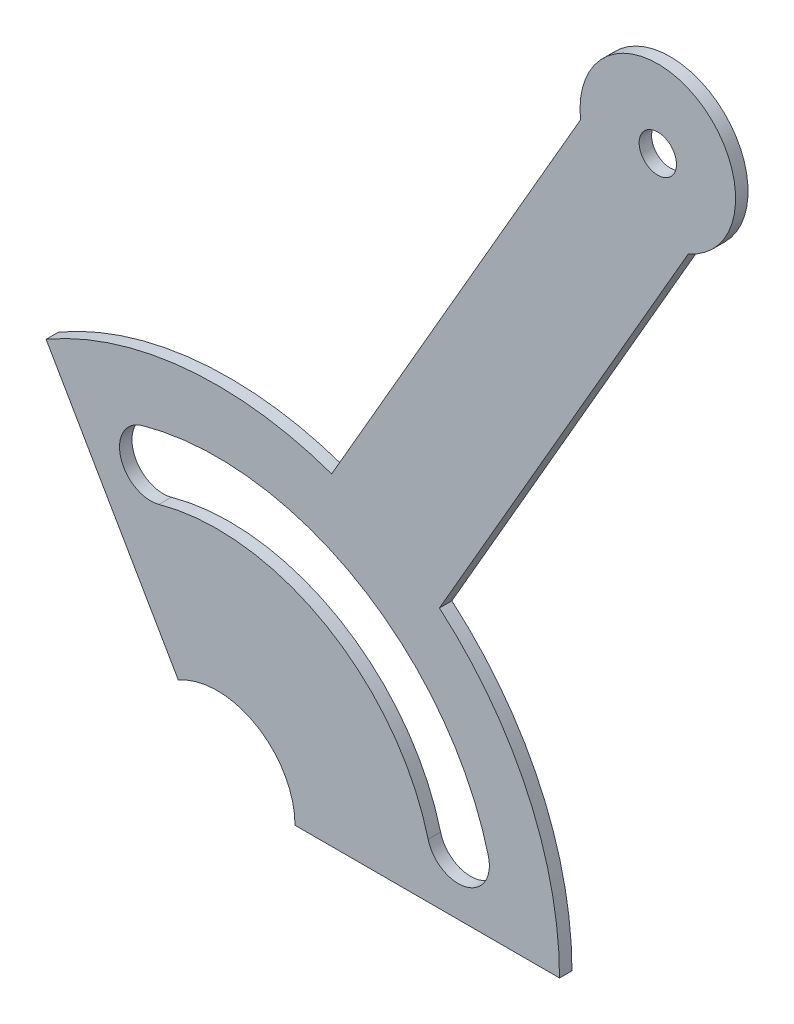
ISO-10303-21;
HEADER;
FILE_DESCRIPTION(('STEP AP214'),'2;1');
FILE_NAME('part.step','',(''),(''),'','','');
FILE_SCHEMA(('AUTOMOTIVE_DESIGN { 1 0 10303 214 1 1 1 1 }'));
ENDSEC;
DATA;
#1=APPLICATION_CONTEXT('core data for automotive mechanical design processes');
#2=APPLICATION_PROTOCOL_DEFINITION('international standard','automotive_design',2000,#1);
#3=PRODUCT_CONTEXT('',#1,'mechanical');
#4=PRODUCT('Part','Part','',(#3));
#5=PRODUCT_RELATED_PRODUCT_CATEGORY('part','',(#4));
#6=PRODUCT_DEFINITION_FORMATION('','',#4);
#7=PRODUCT_DEFINITION_CONTEXT('part definition',#1,'design');
#8=PRODUCT_DEFINITION('design','',#6,#7);
#9=PRODUCT_DEFINITION_SHAPE('','',#8);
#10=(LENGTH_UNIT() NAMED_UNIT(*) SI_UNIT(.MILLI.,.METRE.));
#11=(NAMED_UNIT(*) PLANE_ANGLE_UNIT() SI_UNIT($,.RADIAN.));
#12=(NAMED_UNIT(*) SI_UNIT($,.STERADIAN.) SOLID_ANGLE_UNIT());
#13=UNCERTAINTY_MEASURE_WITH_UNIT(LENGTH_MEASURE(1.E-05),#10,'distance_accuracy_value','');
#14=(GEOMETRIC_REPRESENTATION_CONTEXT(3) GLOBAL_UNCERTAINTY_ASSIGNED_CONTEXT((#13)) GLOBAL_UNIT_ASSIGNED_CONTEXT((#10,
#11,#12)) REPRESENTATION_CONTEXT('',''));
#15=CARTESIAN_POINT('',(0.,0.,0.));
#16=DIRECTION('',(0.,0.,1.));
#17=DIRECTION('',(1.,0.,0.));
#18=AXIS2_PLACEMENT_3D('',#15,#16,#17);
#19=CARTESIAN_POINT('',(0.,0.,-2.));
#20=DIRECTION('',(0.,0.,1.));
#21=DIRECTION('',(1.,0.,0.));
#22=AXIS2_PLACEMENT_3D('',#19,#20,#21);
#23=CYLINDRICAL_SURFACE('',#22,12.5);
#24=CARTESIAN_POINT('',(0.,0.,0.));
#25=DIRECTION('',(0.,0.,-1.));
#26=DIRECTION('',(1.,0.,0.));
#27=AXIS2_PLACEMENT_3D('',#24,#25,#26);
#28=CIRCLE('',#27,12.5);
#29=CARTESIAN_POINT('',(-6.25000000000006,10.8253175473054,0.));
#30=VERTEX_POINT('',#29);
#31=CARTESIAN_POINT('',(12.5,0.,0.));
#32=VERTEX_POINT('',#31);
#33=EDGE_CURVE('E149',#30,#32,#28,.T.);
#34=ORIENTED_EDGE('',*,*,#33,.F.);
#35=DIRECTION('',(0.,0.,1.));
#36=VECTOR('',#35,1.);
#37=CARTESIAN_POINT('',(-6.25000000000006,10.8253175473054,-2.));
#38=LINE('',#37,#36);
#39=CARTESIAN_POINT('',(-6.25000000000006,10.8253175473054,-2.));
#40=VERTEX_POINT('',#39);
#41=EDGE_CURVE('E200',#40,#30,#38,.T.);
#42=ORIENTED_EDGE('',*,*,#41,.F.);
#43=CARTESIAN_POINT('',(0.,0.,-2.));
#44=DIRECTION('',(0.,0.,-1.));
#45=DIRECTION('',(1.,0.,0.));
#46=AXIS2_PLACEMENT_3D('',#43,#44,#45);
#47=CIRCLE('',#46,12.5);
#48=CARTESIAN_POINT('',(12.5,0.,-2.));
#49=VERTEX_POINT('',#48);
#50=EDGE_CURVE('E152',#40,#49,#47,.T.);
#51=ORIENTED_EDGE('',*,*,#50,.T.);
#52=DIRECTION('',(0.,0.,1.));
#53=VECTOR('',#52,1.);
#54=CARTESIAN_POINT('',(12.5,0.,-2.));
#55=LINE('',#54,#53);
#56=EDGE_CURVE('E177',#49,#32,#55,.T.);
#57=ORIENTED_EDGE('',*,*,#56,.T.);
#58=EDGE_LOOP('',(#34,#42,#51,#57));
#59=FACE_BOUND('',#58,.T.);
#60=ADVANCED_FACE('F35',(#59),#23,.F.);
#61=CARTESIAN_POINT('',(-6.25000000000006,10.8253175473054,-2.));
#62=DIRECTION('',(-0.866025403784436,-0.500000000000004,0.));
#63=DIRECTION('',(0.500000000000004,-0.866025403784436,0.));
#64=AXIS2_PLACEMENT_3D('',#61,#62,#63);
#65=PLANE('',#64);
#66=DIRECTION('',(0.500000000000004,-0.866025403784436,0.));
#67=VECTOR('',#66,1.);
#68=CARTESIAN_POINT('',(-6.25000000000006,10.8253175473054,0.));
#69=LINE('',#68,#67);
#70=CARTESIAN_POINT('',(-27.5000000000002,47.631397208144,0.));
#71=VERTEX_POINT('',#70);
#72=EDGE_CURVE('E156',#71,#30,#69,.T.);
#73=ORIENTED_EDGE('',*,*,#72,.F.);
#74=DIRECTION('',(0.,0.,1.));
#75=VECTOR('',#74,1.);
#76=CARTESIAN_POINT('',(-27.5000000000002,47.631397208144,-2.));
#77=LINE('',#76,#75);
#78=CARTESIAN_POINT('',(-27.5000000000002,47.631397208144,-2.));
#79=VERTEX_POINT('',#78);
#80=EDGE_CURVE('E203',#79,#71,#77,.T.);
#81=ORIENTED_EDGE('',*,*,#80,.F.);
#82=DIRECTION('',(0.500000000000004,-0.866025403784436,0.));
#83=VECTOR('',#82,1.);
#84=CARTESIAN_POINT('',(-6.25000000000006,10.8253175473054,-2.));
#85=LINE('',#84,#83);
#86=EDGE_CURVE('E174',#79,#40,#85,.T.);
#87=ORIENTED_EDGE('',*,*,#86,.T.);
#88=ORIENTED_EDGE('',*,*,#41,.T.);
#89=EDGE_LOOP('',(#73,#81,#87,#88));
#90=FACE_BOUND('',#89,.T.);
#91=ADVANCED_FACE('F248',(#90),#65,.T.);
#92=CARTESIAN_POINT('',(0.,0.,-2.));
#93=DIRECTION('',(0.,0.,1.));
#94=DIRECTION('',(1.,0.,0.));
#95=AXIS2_PLACEMENT_3D('',#92,#93,#94);
#96=CYLINDRICAL_SURFACE('',#95,55.);
#97=CARTESIAN_POINT('',(0.,0.,0.));
#98=DIRECTION('',(0.,0.,1.));
#99=DIRECTION('',(1.,0.,0.));
#100=AXIS2_PLACEMENT_3D('',#97,#98,#99);
#101=CIRCLE('',#100,55.);
#102=CARTESIAN_POINT('',(18.3813805281354,51.837484987988,0.));
#103=VERTEX_POINT('',#102);
#104=EDGE_CURVE('E195',#103,#71,#101,.T.);
#105=ORIENTED_EDGE('',*,*,#104,.F.);
#106=DIRECTION('',(0.,0.,1.));
#107=VECTOR('',#106,1.);
#108=CARTESIAN_POINT('',(18.3813805281354,51.837484987988,-2.));
#109=LINE('',#108,#107);
#110=CARTESIAN_POINT('',(18.3813805281354,51.837484987988,-2.));
#111=VERTEX_POINT('',#110);
#112=EDGE_CURVE('E205',#111,#103,#109,.T.);
#113=ORIENTED_EDGE('',*,*,#112,.F.);
#114=CARTESIAN_POINT('',(0.,0.,-2.));
#115=DIRECTION('',(0.,0.,1.));
#116=DIRECTION('',(1.,0.,0.));
#117=AXIS2_PLACEMENT_3D('',#114,#115,#116);
#118=CIRCLE('',#117,55.);
#119=EDGE_CURVE('E171',#111,#79,#118,.T.);
#120=ORIENTED_EDGE('',*,*,#119,.T.);
#121=ORIENTED_EDGE('',*,*,#80,.T.);
#122=EDGE_LOOP('',(#105,#113,#120,#121));
#123=FACE_BOUND('',#122,.T.);
#124=ADVANCED_FACE('F253',(#123),#96,.T.);
#125=CARTESIAN_POINT('',(18.3813805281354,51.837484987988,-2.));
#126=DIRECTION('',(-0.86602540378444,0.499999999999998,0.));
#127=DIRECTION('',(-0.499999999999998,-0.86602540378444,0.));
#128=AXIS2_PLACEMENT_3D('',#125,#126,#127);
#129=PLANE('',#128);
#130=DIRECTION('',(-0.499999999999998,-0.86602540378444,0.));
#131=VECTOR('',#130,1.);
#132=CARTESIAN_POINT('',(18.3813805281354,51.837484987988,0.));
#133=LINE('',#132,#131);
#134=CARTESIAN_POINT('',(58.3813805281352,121.119517290743,0.));
#135=VERTEX_POINT('',#134);
#136=EDGE_CURVE('E192',#135,#103,#133,.T.);
#137=ORIENTED_EDGE('',*,*,#136,.F.);
#138=DIRECTION('',(0.,0.,1.));
#139=VECTOR('',#138,1.);
#140=CARTESIAN_POINT('',(58.3813805281352,121.119517290743,-2.));
#141=LINE('',#140,#139);
#142=CARTESIAN_POINT('',(58.3813805281352,121.119517290743,-2.));
#143=VERTEX_POINT('',#142);
#144=EDGE_CURVE('E207',#143,#135,#141,.T.);
#145=ORIENTED_EDGE('',*,*,#144,.F.);
#146=DIRECTION('',(-0.499999999999998,-0.86602540378444,0.));
#147=VECTOR('',#146,1.);
#148=CARTESIAN_POINT('',(18.3813805281354,51.837484987988,-2.));
#149=LINE('',#148,#147);
#150=EDGE_CURVE('E168',#143,#111,#149,.T.);
#151=ORIENTED_EDGE('',*,*,#150,.T.);
#152=ORIENTED_EDGE('',*,*,#112,.T.);
#153=EDGE_LOOP('',(#137,#145,#151,#152));
#154=FACE_BOUND('',#153,.T.);
#155=ADVANCED_FACE('F278',(#154),#129,.T.);
#156=CARTESIAN_POINT('',(70.7916345659796,122.614707819127,-2.));
#157=DIRECTION('',(0.,0.,1.));
#158=DIRECTION('',(1.,0.,0.));
#159=AXIS2_PLACEMENT_3D('',#156,#157,#158);
#160=CYLINDRICAL_SURFACE('',#159,12.5);
#161=CARTESIAN_POINT('',(70.7916345659796,122.614707819127,0.));
#162=DIRECTION('',(0.,0.,1.));
#163=DIRECTION('',(1.,0.,0.));
#164=AXIS2_PLACEMENT_3D('',#161,#162,#163);
#165=CIRCLE('',#164,12.5);
#166=CARTESIAN_POINT('',(75.701888603824,111.119517290743,0.));
#167=VERTEX_POINT('',#166);
#168=EDGE_CURVE('E189',#167,#135,#165,.T.);
#169=ORIENTED_EDGE('',*,*,#168,.F.);
#170=DIRECTION('',(0.,0.,1.));
#171=VECTOR('',#170,1.);
#172=CARTESIAN_POINT('',(75.701888603824,111.119517290743,-2.));
#173=LINE('',#172,#171);
#174=CARTESIAN_POINT('',(75.701888603824,111.119517290743,-2.));
#175=VERTEX_POINT('',#174);
#176=EDGE_CURVE('E209',#175,#167,#173,.T.);
#177=ORIENTED_EDGE('',*,*,#176,.F.);
#178=CARTESIAN_POINT('',(70.7916345659796,122.614707819127,-2.));
#179=DIRECTION('',(0.,0.,1.));
#180=DIRECTION('',(1.,0.,0.));
#181=AXIS2_PLACEMENT_3D('',#178,#179,#180);
#182=CIRCLE('',#181,12.5);
#183=EDGE_CURVE('E165',#175,#143,#182,.T.);
#184=ORIENTED_EDGE('',*,*,#183,.T.);
#185=ORIENTED_EDGE('',*,*,#144,.T.);
#186=EDGE_LOOP('',(#169,#177,#184,#185));
#187=FACE_BOUND('',#186,.T.);
#188=ADVANCED_FACE('F275',(#187),#160,.T.);
#189=CARTESIAN_POINT('',(35.7018886038242,41.8374849879881,-2.));
#190=DIRECTION('',(0.86602540378444,-0.499999999999998,0.));
#191=DIRECTION('',(0.499999999999998,0.86602540378444,0.));
#192=AXIS2_PLACEMENT_3D('',#189,#190,#191);
#193=PLANE('',#192);
#194=DIRECTION('',(0.499999999999998,0.86602540378444,0.));
#195=VECTOR('',#194,1.);
#196=CARTESIAN_POINT('',(35.7018886038242,41.8374849879881,0.));
#197=LINE('',#196,#195);
#198=CARTESIAN_POINT('',(35.7018886038242,41.8374849879881,0.));
#199=VERTEX_POINT('',#198);
#200=EDGE_CURVE('E186',#199,#167,#197,.T.);
#201=ORIENTED_EDGE('',*,*,#200,.F.);
#202=DIRECTION('',(0.,0.,1.));
#203=VECTOR('',#202,1.);
#204=CARTESIAN_POINT('',(35.7018886038242,41.8374849879881,-2.));
#205=LINE('',#204,#203);
#206=CARTESIAN_POINT('',(35.7018886038242,41.8374849879881,-2.));
#207=VERTEX_POINT('',#206);
#208=EDGE_CURVE('E211',#207,#199,#205,.T.);
#209=ORIENTED_EDGE('',*,*,#208,.F.);
#210=DIRECTION('',(0.499999999999998,0.86602540378444,0.));
#211=VECTOR('',#210,1.);
#212=CARTESIAN_POINT('',(35.7018886038242,41.8374849879881,-2.));
#213=LINE('',#212,#211);
#214=EDGE_CURVE('E162',#207,#175,#213,.T.);
#215=ORIENTED_EDGE('',*,*,#214,.T.);
#216=ORIENTED_EDGE('',*,*,#176,.T.);
#217=EDGE_LOOP('',(#201,#209,#215,#216));
#218=FACE_BOUND('',#217,.T.);
#219=ADVANCED_FACE('F271',(#218),#193,.T.);
#220=CARTESIAN_POINT('',(0.,0.,-2.));
#221=DIRECTION('',(0.,0.,1.));
#222=DIRECTION('',(1.,0.,0.));
#223=AXIS2_PLACEMENT_3D('',#220,#221,#222);
#224=CYLINDRICAL_SURFACE('',#223,55.);
#225=CARTESIAN_POINT('',(0.,0.,0.));
#226=DIRECTION('',(0.,0.,1.));
#227=DIRECTION('',(1.,0.,0.));
#228=AXIS2_PLACEMENT_3D('',#225,#226,#227);
#229=CIRCLE('',#228,55.);
#230=CARTESIAN_POINT('',(55.,0.,0.));
#231=VERTEX_POINT('',#230);
#232=EDGE_CURVE('E183',#231,#199,#229,.T.);
#233=ORIENTED_EDGE('',*,*,#232,.F.);
#234=DIRECTION('',(0.,0.,1.));
#235=VECTOR('',#234,1.);
#236=CARTESIAN_POINT('',(55.,0.,-2.));
#237=LINE('',#236,#235);
#238=CARTESIAN_POINT('',(55.,0.,-2.));
#239=VERTEX_POINT('',#238);
#240=EDGE_CURVE('E213',#239,#231,#237,.T.);
#241=ORIENTED_EDGE('',*,*,#240,.F.);
#242=CARTESIAN_POINT('',(0.,0.,-2.));
#243=DIRECTION('',(0.,0.,1.));
#244=DIRECTION('',(1.,0.,0.));
#245=AXIS2_PLACEMENT_3D('',#242,#243,#244);
#246=CIRCLE('',#245,55.);
#247=EDGE_CURVE('E159',#239,#207,#246,.T.);
#248=ORIENTED_EDGE('',*,*,#247,.T.);
#249=ORIENTED_EDGE('',*,*,#208,.T.);
#250=EDGE_LOOP('',(#233,#241,#248,#249));
#251=FACE_BOUND('',#250,.T.);
#252=ADVANCED_FACE('F244',(#251),#224,.T.);
#253=CARTESIAN_POINT('',(12.5,0.,-2.));
#254=DIRECTION('',(0.,-1.,0.));
#255=DIRECTION('',(0.,0.,-1.));
#256=AXIS2_PLACEMENT_3D('',#253,#254,#255);
#257=PLANE('',#256);
#258=DIRECTION('',(1.,0.,0.));
#259=VECTOR('',#258,1.);
#260=CARTESIAN_POINT('',(12.5,0.,0.));
#261=LINE('',#260,#259);
#262=EDGE_CURVE('E180',#32,#231,#261,.T.);
#263=ORIENTED_EDGE('',*,*,#262,.F.);
#264=ORIENTED_EDGE('',*,*,#56,.F.);
#265=DIRECTION('',(1.,0.,0.));
#266=VECTOR('',#265,1.);
#267=CARTESIAN_POINT('',(12.5,0.,-2.));
#268=LINE('',#267,#266);
#269=EDGE_CURVE('E155',#49,#239,#268,.T.);
#270=ORIENTED_EDGE('',*,*,#269,.T.);
#271=ORIENTED_EDGE('',*,*,#240,.T.);
#272=EDGE_LOOP('',(#263,#264,#270,#271));
#273=FACE_BOUND('',#272,.T.);
#274=ADVANCED_FACE('F236',(#273),#257,.T.);
#275=CARTESIAN_POINT('',(0.,0.,-2.));
#276=DIRECTION('',(0.,0.,1.));
#277=DIRECTION('',(1.,0.,0.));
#278=AXIS2_PLACEMENT_3D('',#275,#276,#277);
#279=PLANE('',#278);
#280=CARTESIAN_POINT('',(70.7916345659796,122.614707819127,-2.));
#281=DIRECTION('',(0.,0.,-1.));
#282=DIRECTION('',(-1.,0.,0.));
#283=AXIS2_PLACEMENT_3D('',#280,#281,#282);
#284=CIRCLE('',#283,3.00000000000001);
#285=CARTESIAN_POINT('',(67.7916345659796,122.614707819127,-2.));
#286=VERTEX_POINT('',#285);
#287=EDGE_CURVE('E228',#286,#286,#284,.T.);
#288=ORIENTED_EDGE('',*,*,#287,.F.);
#289=EDGE_LOOP('',(#288));
#290=FACE_BOUND('',#289,.T.);
#291=CARTESIAN_POINT('',(0.,0.,-2.));
#292=DIRECTION('',(0.,0.,-1.));
#293=DIRECTION('',(-1.,0.,0.));
#294=AXIS2_PLACEMENT_3D('',#291,#292,#293);
#295=CIRCLE('',#294,45.);
#296=CARTESIAN_POINT('',(-12.0427455298421,43.3586471203089,-2.));
#297=VERTEX_POINT('',#296);
#298=CARTESIAN_POINT('',(43.5710626448334,11.25,-2.));
#299=VERTEX_POINT('',#298);
#300=EDGE_CURVE('E135',#297,#299,#295,.T.);
#301=ORIENTED_EDGE('',*,*,#300,.F.);
#302=CARTESIAN_POINT('',(-10.704662693193,38.5410196624968,-2.));
#303=DIRECTION('',(0.,0.,-1.));
#304=DIRECTION('',(-1.,0.,0.));
#305=AXIS2_PLACEMENT_3D('',#302,#303,#304);
#306=CIRCLE('',#305,5.);
#307=CARTESIAN_POINT('',(-9.36657985654385,33.7233922046847,-2.));
#308=VERTEX_POINT('',#307);
#309=EDGE_CURVE('E50',#308,#297,#306,.T.);
#310=ORIENTED_EDGE('',*,*,#309,.F.);
#311=CARTESIAN_POINT('',(0.,0.,-2.));
#312=DIRECTION('',(0.,0.,1.));
#313=DIRECTION('',(-1.,0.,0.));
#314=AXIS2_PLACEMENT_3D('',#311,#312,#313);
#315=CIRCLE('',#314,35.);
#316=CARTESIAN_POINT('',(33.8886042793149,8.75,-2.));
#317=VERTEX_POINT('',#316);
#318=EDGE_CURVE('E142',#317,#308,#315,.T.);
#319=ORIENTED_EDGE('',*,*,#318,.F.);
#320=CARTESIAN_POINT('',(38.7298334620742,10.,-2.));
#321=DIRECTION('',(0.,0.,-1.));
#322=DIRECTION('',(-1.,0.,0.));
#323=AXIS2_PLACEMENT_3D('',#320,#321,#322);
#324=CIRCLE('',#323,5.);
#325=EDGE_CURVE('E126',#299,#317,#324,.T.);
#326=ORIENTED_EDGE('',*,*,#325,.F.);
#327=EDGE_LOOP('',(#301,#310,#319,#326));
#328=FACE_BOUND('',#327,.T.);
#329=ORIENTED_EDGE('',*,*,#50,.F.);
#330=ORIENTED_EDGE('',*,*,#86,.F.);
#331=ORIENTED_EDGE('',*,*,#119,.F.);
#332=ORIENTED_EDGE('',*,*,#150,.F.);
#333=ORIENTED_EDGE('',*,*,#183,.F.);
#334=ORIENTED_EDGE('',*,*,#214,.F.);
#335=ORIENTED_EDGE('',*,*,#247,.F.);
#336=ORIENTED_EDGE('',*,*,#269,.F.);
#337=EDGE_LOOP('',(#329,#330,#331,#332,#333,#334,#335,#336));
#338=FACE_BOUND('',#337,.T.);
#339=ADVANCED_FACE('F139',(#290,#328,#338),#279,.F.);
#340=CARTESIAN_POINT('',(0.,0.,0.));
#341=DIRECTION('',(0.,0.,1.));
#342=DIRECTION('',(1.,0.,0.));
#343=AXIS2_PLACEMENT_3D('',#340,#341,#342);
#344=PLANE('',#343);
#345=CARTESIAN_POINT('',(70.7916345659796,122.614707819127,0.));
#346=DIRECTION('',(0.,0.,1.));
#347=DIRECTION('',(1.,0.,0.));
#348=AXIS2_PLACEMENT_3D('',#345,#346,#347);
#349=CIRCLE('',#348,3.00000000000001);
#350=CARTESIAN_POINT('',(73.7916345659796,122.614707819127,0.));
#351=VERTEX_POINT('',#350);
#352=EDGE_CURVE('E38',#351,#351,#349,.T.);
#353=ORIENTED_EDGE('',*,*,#352,.F.);
#354=EDGE_LOOP('',(#353));
#355=FACE_BOUND('',#354,.T.);
#356=CARTESIAN_POINT('',(-10.704662693193,38.5410196624968,0.));
#357=DIRECTION('',(0.,0.,1.));
#358=DIRECTION('',(1.,0.,0.));
#359=AXIS2_PLACEMENT_3D('',#356,#357,#358);
#360=CIRCLE('',#359,5.);
#361=CARTESIAN_POINT('',(-12.0427455298421,43.3586471203089,0.));
#362=VERTEX_POINT('',#361);
#363=CARTESIAN_POINT('',(-9.36657985654385,33.7233922046847,0.));
#364=VERTEX_POINT('',#363);
#365=EDGE_CURVE('E11',#362,#364,#360,.T.);
#366=ORIENTED_EDGE('',*,*,#365,.F.);
#367=CARTESIAN_POINT('',(0.,0.,0.));
#368=DIRECTION('',(0.,0.,1.));
#369=DIRECTION('',(1.,0.,0.));
#370=AXIS2_PLACEMENT_3D('',#367,#368,#369);
#371=CIRCLE('',#370,45.);
#372=CARTESIAN_POINT('',(43.5710626448334,11.25,0.));
#373=VERTEX_POINT('',#372);
#374=EDGE_CURVE('E202',#373,#362,#371,.T.);
#375=ORIENTED_EDGE('',*,*,#374,.F.);
#376=CARTESIAN_POINT('',(38.7298334620742,10.,0.));
#377=DIRECTION('',(0.,0.,1.));
#378=DIRECTION('',(1.,0.,0.));
#379=AXIS2_PLACEMENT_3D('',#376,#377,#378);
#380=CIRCLE('',#379,5.);
#381=CARTESIAN_POINT('',(33.8886042793149,8.75,0.));
#382=VERTEX_POINT('',#381);
#383=EDGE_CURVE('E129',#382,#373,#380,.T.);
#384=ORIENTED_EDGE('',*,*,#383,.F.);
#385=CARTESIAN_POINT('',(0.,0.,0.));
#386=DIRECTION('',(0.,0.,1.));
#387=DIRECTION('',(1.,0.,0.));
#388=AXIS2_PLACEMENT_3D('',#385,#386,#387);
#389=CIRCLE('',#388,35.);
#390=EDGE_CURVE('E43',#364,#382,#389,.F.);
#391=ORIENTED_EDGE('',*,*,#390,.F.);
#392=EDGE_LOOP('',(#366,#375,#384,#391));
#393=FACE_BOUND('',#392,.T.);
#394=ORIENTED_EDGE('',*,*,#33,.T.);
#395=ORIENTED_EDGE('',*,*,#262,.T.);
#396=ORIENTED_EDGE('',*,*,#232,.T.);
#397=ORIENTED_EDGE('',*,*,#200,.T.);
#398=ORIENTED_EDGE('',*,*,#168,.T.);
#399=ORIENTED_EDGE('',*,*,#136,.T.);
#400=ORIENTED_EDGE('',*,*,#104,.T.);
#401=ORIENTED_EDGE('',*,*,#72,.T.);
#402=EDGE_LOOP('',(#394,#395,#396,#397,#398,#399,#400,#401));
#403=FACE_BOUND('',#402,.T.);
#404=ADVANCED_FACE('F224',(#355,#393,#403),#344,.T.);
#405=CARTESIAN_POINT('',(-10.704662693193,38.5410196624968,8.));
#406=DIRECTION('',(0.,0.,-1.));
#407=DIRECTION('',(-1.,0.,0.));
#408=AXIS2_PLACEMENT_3D('',#405,#406,#407);
#409=CYLINDRICAL_SURFACE('',#408,5.);
#410=ORIENTED_EDGE('',*,*,#365,.T.);
#411=DIRECTION('',(0.,0.,-1.));
#412=VECTOR('',#411,1.);
#413=CARTESIAN_POINT('',(-9.36657985654385,33.7233922046847,8.));
#414=LINE('',#413,#412);
#415=EDGE_CURVE('E147',#364,#308,#414,.T.);
#416=ORIENTED_EDGE('',*,*,#415,.T.);
#417=ORIENTED_EDGE('',*,*,#309,.T.);
#418=DIRECTION('',(0.,0.,-1.));
#419=VECTOR('',#418,1.);
#420=CARTESIAN_POINT('',(-12.0427455298421,43.3586471203089,8.));
#421=LINE('',#420,#419);
#422=EDGE_CURVE('E132',#362,#297,#421,.T.);
#423=ORIENTED_EDGE('',*,*,#422,.F.);
#424=EDGE_LOOP('',(#410,#416,#417,#423));
#425=FACE_BOUND('',#424,.T.);
#426=ADVANCED_FACE('F226',(#425),#409,.F.);
#427=CARTESIAN_POINT('',(0.,0.,8.));
#428=DIRECTION('',(0.,0.,-1.));
#429=DIRECTION('',(-1.,0.,0.));
#430=AXIS2_PLACEMENT_3D('',#427,#428,#429);
#431=CYLINDRICAL_SURFACE('',#430,35.);
#432=ORIENTED_EDGE('',*,*,#390,.T.);
#433=DIRECTION('',(0.,0.,-1.));
#434=VECTOR('',#433,1.);
#435=CARTESIAN_POINT('',(33.8886042793149,8.75,8.));
#436=LINE('',#435,#434);
#437=EDGE_CURVE('E131',#382,#317,#436,.T.);
#438=ORIENTED_EDGE('',*,*,#437,.T.);
#439=ORIENTED_EDGE('',*,*,#318,.T.);
#440=ORIENTED_EDGE('',*,*,#415,.F.);
#441=EDGE_LOOP('',(#432,#438,#439,#440));
#442=FACE_BOUND('',#441,.T.);
#443=ADVANCED_FACE('F221',(#442),#431,.T.);
#444=CARTESIAN_POINT('',(38.7298334620742,10.,8.));
#445=DIRECTION('',(0.,0.,-1.));
#446=DIRECTION('',(-1.,0.,0.));
#447=AXIS2_PLACEMENT_3D('',#444,#445,#446);
#448=CYLINDRICAL_SURFACE('',#447,5.);
#449=ORIENTED_EDGE('',*,*,#383,.T.);
#450=DIRECTION('',(0.,0.,-1.));
#451=VECTOR('',#450,1.);
#452=CARTESIAN_POINT('',(43.5710626448334,11.25,8.));
#453=LINE('',#452,#451);
#454=EDGE_CURVE('E58',#373,#299,#453,.T.);
#455=ORIENTED_EDGE('',*,*,#454,.T.);
#456=ORIENTED_EDGE('',*,*,#325,.T.);
#457=ORIENTED_EDGE('',*,*,#437,.F.);
#458=EDGE_LOOP('',(#449,#455,#456,#457));
#459=FACE_BOUND('',#458,.T.);
#460=ADVANCED_FACE('F123',(#459),#448,.F.);
#461=CARTESIAN_POINT('',(0.,0.,8.));
#462=DIRECTION('',(0.,0.,-1.));
#463=DIRECTION('',(-1.,0.,0.));
#464=AXIS2_PLACEMENT_3D('',#461,#462,#463);
#465=CYLINDRICAL_SURFACE('',#464,45.);
#466=ORIENTED_EDGE('',*,*,#374,.T.);
#467=ORIENTED_EDGE('',*,*,#422,.T.);
#468=ORIENTED_EDGE('',*,*,#300,.T.);
#469=ORIENTED_EDGE('',*,*,#454,.F.);
#470=EDGE_LOOP('',(#466,#467,#468,#469));
#471=FACE_BOUND('',#470,.T.);
#472=ADVANCED_FACE('F136',(#471),#465,.F.);
#473=CARTESIAN_POINT('',(70.7916345659796,122.614707819127,8.));
#474=DIRECTION('',(0.,0.,-1.));
#475=DIRECTION('',(-1.,0.,0.));
#476=AXIS2_PLACEMENT_3D('',#473,#474,#475);
#477=CYLINDRICAL_SURFACE('',#476,3.00000000000001);
#478=ORIENTED_EDGE('',*,*,#352,.T.);
#479=EDGE_LOOP('',(#478));
#480=FACE_BOUND('',#479,.T.);
#481=ORIENTED_EDGE('',*,*,#287,.T.);
#482=EDGE_LOOP('',(#481));
#483=FACE_BOUND('',#482,.T.);
#484=ADVANCED_FACE('F233',(#480,#483),#477,.F.);
#485=CLOSED_SHELL('',(#60,#91,#124,#155,#188,#219,#252,#274,#339,#404,#426,#443,#460,#472,#484));
#486=MANIFOLD_SOLID_BREP('B2',#485);
#487=ADVANCED_BREP_SHAPE_REPRESENTATION('',(#18,#486),#14);
#488=SHAPE_DEFINITION_REPRESENTATION(#9,#487);
ENDSEC;
END-ISO-10303-21;
